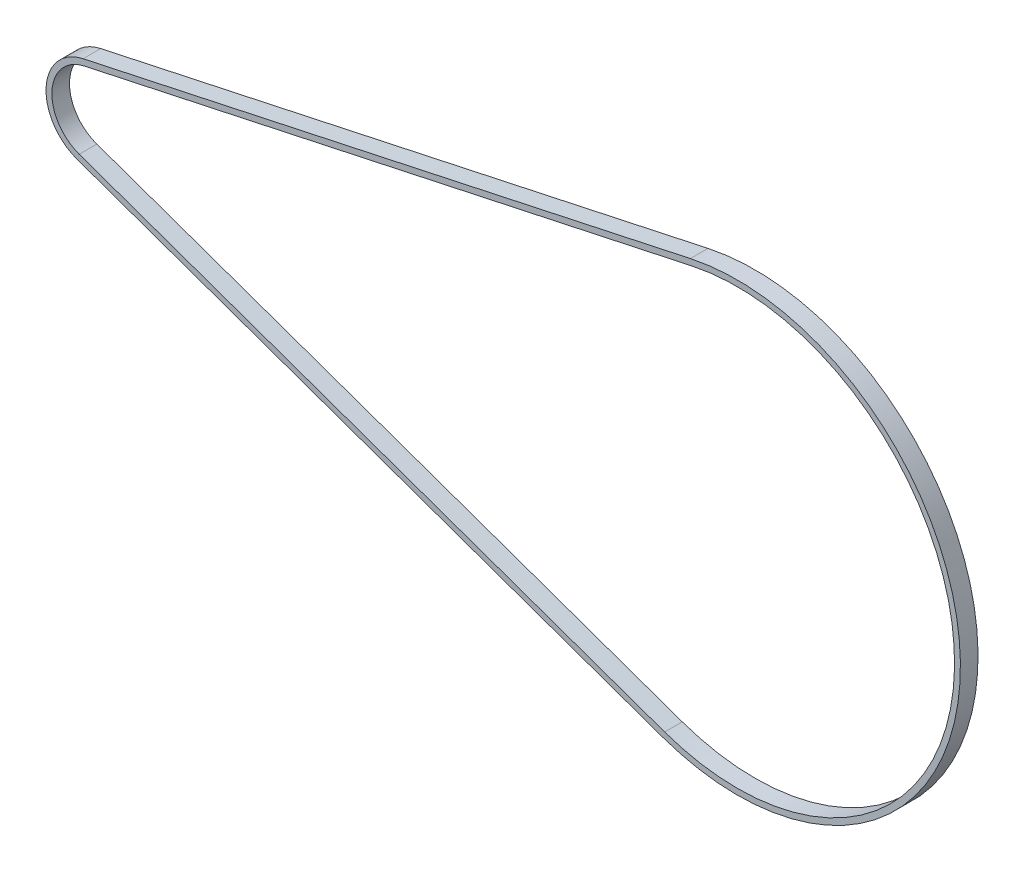
ISO-10303-21;
HEADER;
FILE_DESCRIPTION(('STEP AP214'),'2;1');
FILE_NAME('part.step','',(''),(''),'','','');
FILE_SCHEMA(('AUTOMOTIVE_DESIGN { 1 0 10303 214 1 1 1 1 }'));
ENDSEC;
DATA;
#1=APPLICATION_CONTEXT('core data for automotive mechanical design processes');
#2=APPLICATION_PROTOCOL_DEFINITION('international standard','automotive_design',2000,#1);
#3=PRODUCT_CONTEXT('',#1,'mechanical');
#4=PRODUCT('Part','Part','',(#3));
#5=PRODUCT_RELATED_PRODUCT_CATEGORY('part','',(#4));
#6=PRODUCT_DEFINITION_FORMATION('','',#4);
#7=PRODUCT_DEFINITION_CONTEXT('part definition',#1,'design');
#8=PRODUCT_DEFINITION('design','',#6,#7);
#9=PRODUCT_DEFINITION_SHAPE('','',#8);
#10=(LENGTH_UNIT() NAMED_UNIT(*) SI_UNIT(.MILLI.,.METRE.));
#11=(NAMED_UNIT(*) PLANE_ANGLE_UNIT() SI_UNIT($,.RADIAN.));
#12=(NAMED_UNIT(*) SI_UNIT($,.STERADIAN.) SOLID_ANGLE_UNIT());
#13=UNCERTAINTY_MEASURE_WITH_UNIT(LENGTH_MEASURE(1.E-05),#10,'distance_accuracy_value','');
#14=(GEOMETRIC_REPRESENTATION_CONTEXT(3) GLOBAL_UNCERTAINTY_ASSIGNED_CONTEXT((#13)) GLOBAL_UNIT_ASSIGNED_CONTEXT((#10,
#11,#12)) REPRESENTATION_CONTEXT('',''));
#15=CARTESIAN_POINT('',(0.,0.,0.));
#16=DIRECTION('',(0.,0.,1.));
#17=DIRECTION('',(1.,0.,0.));
#18=AXIS2_PLACEMENT_3D('',#15,#16,#17);
#19=CARTESIAN_POINT('',(0.,0.,3.81));
#20=DIRECTION('',(0.,0.,-1.));
#21=DIRECTION('',(-1.,0.,0.));
#22=AXIS2_PLACEMENT_3D('',#19,#20,#21);
#23=CYLINDRICAL_SURFACE('',#22,20.32);
#24=CARTESIAN_POINT('',(0.,0.,-3.81));
#25=DIRECTION('',(0.,0.,-1.));
#26=DIRECTION('',(-1.,0.,0.));
#27=AXIS2_PLACEMENT_3D('',#24,#25,#26);
#28=CIRCLE('',#27,20.32);
#29=CARTESIAN_POINT('',(-6.7917738220056,-19.1513500398985,-3.81));
#30=VERTEX_POINT('',#29);
#31=CARTESIAN_POINT('',(-4.27179083616771,19.8659055432173,-3.81));
#32=VERTEX_POINT('',#31);
#33=EDGE_CURVE('E157',#30,#32,#28,.T.);
#34=ORIENTED_EDGE('',*,*,#33,.F.);
#35=DIRECTION('',(0.,0.,-1.));
#36=VECTOR('',#35,1.);
#37=CARTESIAN_POINT('',(-6.7917738220056,-19.1513500398985,3.81));
#38=LINE('',#37,#36);
#39=CARTESIAN_POINT('',(-6.7917738220056,-19.1513500398985,3.81));
#40=VERTEX_POINT('',#39);
#41=EDGE_CURVE('E12',#40,#30,#38,.T.);
#42=ORIENTED_EDGE('',*,*,#41,.F.);
#43=CARTESIAN_POINT('',(0.,0.,3.81));
#44=DIRECTION('',(0.,0.,-1.));
#45=DIRECTION('',(-1.,0.,0.));
#46=AXIS2_PLACEMENT_3D('',#43,#44,#45);
#47=CIRCLE('',#46,20.32);
#48=CARTESIAN_POINT('',(-4.27179083616771,19.8659055432173,3.81));
#49=VERTEX_POINT('',#48);
#50=EDGE_CURVE('E161',#40,#49,#47,.T.);
#51=ORIENTED_EDGE('',*,*,#50,.T.);
#52=DIRECTION('',(0.,0.,-1.));
#53=VECTOR('',#52,1.);
#54=CARTESIAN_POINT('',(-4.27179083616771,19.8659055432173,3.81));
#55=LINE('',#54,#53);
#56=EDGE_CURVE('E62',#49,#32,#55,.T.);
#57=ORIENTED_EDGE('',*,*,#56,.T.);
#58=EDGE_LOOP('',(#34,#42,#51,#57));
#59=FACE_BOUND('',#58,.T.);
#60=ADVANCED_FACE('F59',(#59),#23,.T.);
#61=CARTESIAN_POINT('',(-6.79177382200558,-19.1513500398985,3.81));
#62=DIRECTION('',(-0.334240837697125,-0.942487698813902,0.));
#63=DIRECTION('',(0.942487698813902,-0.334240837697125,0.));
#64=AXIS2_PLACEMENT_3D('',#61,#62,#63);
#65=PLANE('',#64);
#66=DIRECTION('',(-0.942487698813902,0.334240837697125,0.));
#67=VECTOR('',#66,1.);
#68=CARTESIAN_POINT('',(-6.79177382200558,-19.1513500398985,-3.81));
#69=LINE('',#68,#67);
#70=CARTESIAN_POINT('',(246.48321338445,-108.971985362938,-3.81));
#71=VERTEX_POINT('',#70);
#72=EDGE_CURVE('E165',#71,#30,#69,.T.);
#73=ORIENTED_EDGE('',*,*,#72,.F.);
#74=DIRECTION('',(0.,0.,-1.));
#75=VECTOR('',#74,1.);
#76=CARTESIAN_POINT('',(246.48321338445,-108.971985362938,3.81));
#77=LINE('',#76,#75);
#78=CARTESIAN_POINT('',(246.48321338445,-108.971985362938,3.81));
#79=VERTEX_POINT('',#78);
#80=EDGE_CURVE('E67',#79,#71,#77,.T.);
#81=ORIENTED_EDGE('',*,*,#80,.F.);
#82=DIRECTION('',(-0.942487698813902,0.334240837697125,0.));
#83=VECTOR('',#82,1.);
#84=CARTESIAN_POINT('',(-6.79177382200558,-19.1513500398985,3.81));
#85=LINE('',#84,#83);
#86=EDGE_CURVE('E171',#79,#40,#85,.T.);
#87=ORIENTED_EDGE('',*,*,#86,.T.);
#88=ORIENTED_EDGE('',*,*,#41,.T.);
#89=EDGE_LOOP('',(#73,#81,#87,#88));
#90=FACE_BOUND('',#89,.T.);
#91=ADVANCED_FACE('F197',(#90),#65,.T.);
#92=CARTESIAN_POINT('',(278.744139038976,-18.0030726734202,3.81));
#93=DIRECTION('',(0.,0.,-1.));
#94=DIRECTION('',(-1.,0.,0.));
#95=AXIS2_PLACEMENT_3D('',#92,#93,#94);
#96=CYLINDRICAL_SURFACE('',#95,96.52);
#97=CARTESIAN_POINT('',(278.744139038976,-18.0030726734202,-3.81));
#98=DIRECTION('',(0.,0.,-1.));
#99=DIRECTION('',(-1.,0.,0.));
#100=AXIS2_PLACEMENT_3D('',#97,#98,#99);
#101=CIRCLE('',#100,96.52);
#102=CARTESIAN_POINT('',(258.45313256718,76.3599786568622,-3.81));
#103=VERTEX_POINT('',#102);
#104=EDGE_CURVE('E179',#103,#71,#101,.T.);
#105=ORIENTED_EDGE('',*,*,#104,.F.);
#106=DIRECTION('',(0.,0.,-1.));
#107=VECTOR('',#106,1.);
#108=CARTESIAN_POINT('',(258.45313256718,76.3599786568622,3.81));
#109=LINE('',#108,#107);
#110=CARTESIAN_POINT('',(258.45313256718,76.3599786568622,3.81));
#111=VERTEX_POINT('',#110);
#112=EDGE_CURVE('E184',#111,#103,#109,.T.);
#113=ORIENTED_EDGE('',*,*,#112,.F.);
#114=CARTESIAN_POINT('',(278.744139038976,-18.0030726734202,3.81));
#115=DIRECTION('',(0.,0.,-1.));
#116=DIRECTION('',(-1.,0.,0.));
#117=AXIS2_PLACEMENT_3D('',#114,#115,#116);
#118=CIRCLE('',#117,96.52);
#119=EDGE_CURVE('E168',#111,#79,#118,.T.);
#120=ORIENTED_EDGE('',*,*,#119,.T.);
#121=ORIENTED_EDGE('',*,*,#80,.T.);
#122=EDGE_LOOP('',(#105,#113,#120,#121));
#123=FACE_BOUND('',#122,.T.);
#124=ADVANCED_FACE('F201',(#123),#96,.T.);
#125=CARTESIAN_POINT('',(-4.27179083616771,19.8659055432173,3.81));
#126=DIRECTION('',(-0.210225926976758,0.977652831851247,0.));
#127=DIRECTION('',(-0.977652831851247,-0.210225926976758,0.));
#128=AXIS2_PLACEMENT_3D('',#125,#126,#127);
#129=PLANE('',#128);
#130=DIRECTION('',(0.977652831851247,0.210225926976758,0.));
#131=VECTOR('',#130,1.);
#132=CARTESIAN_POINT('',(-4.27179083616771,19.8659055432173,-3.81));
#133=LINE('',#132,#131);
#134=EDGE_CURVE('E176',#32,#103,#133,.T.);
#135=ORIENTED_EDGE('',*,*,#134,.F.);
#136=ORIENTED_EDGE('',*,*,#56,.F.);
#137=DIRECTION('',(0.977652831851247,0.210225926976758,0.));
#138=VECTOR('',#137,1.);
#139=CARTESIAN_POINT('',(-4.27179083616771,19.8659055432173,3.81));
#140=LINE('',#139,#138);
#141=EDGE_CURVE('E164',#49,#111,#140,.T.);
#142=ORIENTED_EDGE('',*,*,#141,.T.);
#143=ORIENTED_EDGE('',*,*,#112,.T.);
#144=EDGE_LOOP('',(#135,#136,#142,#143));
#145=FACE_BOUND('',#144,.T.);
#146=ADVANCED_FACE('F192',(#145),#129,.T.);
#147=CARTESIAN_POINT('',(0.,0.,3.81));
#148=DIRECTION('',(0.,0.,-1.));
#149=DIRECTION('',(-1.,0.,0.));
#150=AXIS2_PLACEMENT_3D('',#147,#148,#149);
#151=PLANE('',#150);
#152=DIRECTION('',(-0.942487698813902,0.334240837697125,0.));
#153=VECTOR('',#152,1.);
#154=CARTESIAN_POINT('',(247.3321851122,-106.578066607951,3.81));
#155=LINE('',#154,#153);
#156=CARTESIAN_POINT('',(247.3321851122,-106.578066607951,3.81));
#157=VERTEX_POINT('',#156);
#158=CARTESIAN_POINT('',(-5.94280209425489,-16.7574312849112,3.81));
#159=VERTEX_POINT('',#158);
#160=EDGE_CURVE('E132',#157,#159,#155,.T.);
#161=ORIENTED_EDGE('',*,*,#160,.T.);
#162=CARTESIAN_POINT('',(0.,0.,3.81));
#163=DIRECTION('',(0.,0.,-1.));
#164=DIRECTION('',(-1.,0.,0.));
#165=AXIS2_PLACEMENT_3D('',#162,#163,#164);
#166=CIRCLE('',#165,17.78);
#167=CARTESIAN_POINT('',(-3.73781698164675,17.3826673503152,3.81));
#168=VERTEX_POINT('',#167);
#169=EDGE_CURVE('E126',#159,#168,#166,.T.);
#170=ORIENTED_EDGE('',*,*,#169,.T.);
#171=DIRECTION('',(0.977652831851247,0.210225926976758,0.));
#172=VECTOR('',#171,1.);
#173=CARTESIAN_POINT('',(-3.73781698164675,17.3826673503152,3.81));
#174=LINE('',#173,#172);
#175=CARTESIAN_POINT('',(258.9871064217,73.87674046396,3.81));
#176=VERTEX_POINT('',#175);
#177=EDGE_CURVE('E135',#168,#176,#174,.T.);
#178=ORIENTED_EDGE('',*,*,#177,.T.);
#179=CARTESIAN_POINT('',(278.744139038976,-18.0030726734202,3.81));
#180=DIRECTION('',(0.,0.,-1.));
#181=DIRECTION('',(-1.,0.,0.));
#182=AXIS2_PLACEMENT_3D('',#179,#180,#181);
#183=CIRCLE('',#182,93.98);
#184=EDGE_CURVE('E75',#176,#157,#183,.T.);
#185=ORIENTED_EDGE('',*,*,#184,.T.);
#186=EDGE_LOOP('',(#161,#170,#178,#185));
#187=FACE_BOUND('',#186,.T.);
#188=ORIENTED_EDGE('',*,*,#50,.F.);
#189=ORIENTED_EDGE('',*,*,#86,.F.);
#190=ORIENTED_EDGE('',*,*,#119,.F.);
#191=ORIENTED_EDGE('',*,*,#141,.F.);
#192=EDGE_LOOP('',(#188,#189,#190,#191));
#193=FACE_BOUND('',#192,.T.);
#194=ADVANCED_FACE('F139',(#187,#193),#151,.F.);
#195=CARTESIAN_POINT('',(0.,0.,-3.81));
#196=DIRECTION('',(0.,0.,-1.));
#197=DIRECTION('',(-1.,0.,0.));
#198=AXIS2_PLACEMENT_3D('',#195,#196,#197);
#199=PLANE('',#198);
#200=CARTESIAN_POINT('',(0.,0.,-3.81));
#201=DIRECTION('',(0.,0.,-1.));
#202=DIRECTION('',(-1.,0.,0.));
#203=AXIS2_PLACEMENT_3D('',#200,#201,#202);
#204=CIRCLE('',#203,17.78);
#205=CARTESIAN_POINT('',(-5.94280209425489,-16.7574312849112,-3.81));
#206=VERTEX_POINT('',#205);
#207=CARTESIAN_POINT('',(-3.73781698164675,17.3826673503152,-3.81));
#208=VERTEX_POINT('',#207);
#209=EDGE_CURVE('E83',#206,#208,#204,.T.);
#210=ORIENTED_EDGE('',*,*,#209,.F.);
#211=DIRECTION('',(-0.942487698813902,0.334240837697125,0.));
#212=VECTOR('',#211,1.);
#213=CARTESIAN_POINT('',(247.3321851122,-106.578066607951,-3.81));
#214=LINE('',#213,#212);
#215=CARTESIAN_POINT('',(247.3321851122,-106.578066607951,-3.81));
#216=VERTEX_POINT('',#215);
#217=EDGE_CURVE('E142',#216,#206,#214,.T.);
#218=ORIENTED_EDGE('',*,*,#217,.F.);
#219=CARTESIAN_POINT('',(278.744139038976,-18.0030726734202,-3.81));
#220=DIRECTION('',(0.,0.,-1.));
#221=DIRECTION('',(-1.,0.,0.));
#222=AXIS2_PLACEMENT_3D('',#219,#220,#221);
#223=CIRCLE('',#222,93.98);
#224=CARTESIAN_POINT('',(258.9871064217,73.87674046396,-3.81));
#225=VERTEX_POINT('',#224);
#226=EDGE_CURVE('E145',#225,#216,#223,.T.);
#227=ORIENTED_EDGE('',*,*,#226,.F.);
#228=DIRECTION('',(0.977652831851247,0.210225926976758,0.));
#229=VECTOR('',#228,1.);
#230=CARTESIAN_POINT('',(-3.73781698164675,17.3826673503152,-3.81));
#231=LINE('',#230,#229);
#232=EDGE_CURVE('E151',#208,#225,#231,.T.);
#233=ORIENTED_EDGE('',*,*,#232,.F.);
#234=EDGE_LOOP('',(#210,#218,#227,#233));
#235=FACE_BOUND('',#234,.T.);
#236=ORIENTED_EDGE('',*,*,#33,.T.);
#237=ORIENTED_EDGE('',*,*,#134,.T.);
#238=ORIENTED_EDGE('',*,*,#104,.T.);
#239=ORIENTED_EDGE('',*,*,#72,.T.);
#240=EDGE_LOOP('',(#236,#237,#238,#239));
#241=FACE_BOUND('',#240,.T.);
#242=ADVANCED_FACE('F194',(#235,#241),#199,.T.);
#243=CARTESIAN_POINT('',(0.,0.,3.81));
#244=DIRECTION('',(0.,0.,-1.));
#245=DIRECTION('',(-1.,0.,0.));
#246=AXIS2_PLACEMENT_3D('',#243,#244,#245);
#247=CYLINDRICAL_SURFACE('',#246,17.78);
#248=ORIENTED_EDGE('',*,*,#209,.T.);
#249=DIRECTION('',(0.,0.,-1.));
#250=VECTOR('',#249,1.);
#251=CARTESIAN_POINT('',(-3.73781698164675,17.3826673503152,3.81));
#252=LINE('',#251,#250);
#253=EDGE_CURVE('E122',#168,#208,#252,.T.);
#254=ORIENTED_EDGE('',*,*,#253,.F.);
#255=ORIENTED_EDGE('',*,*,#169,.F.);
#256=DIRECTION('',(0.,0.,-1.));
#257=VECTOR('',#256,1.);
#258=CARTESIAN_POINT('',(-5.94280209425489,-16.7574312849112,3.81));
#259=LINE('',#258,#257);
#260=EDGE_CURVE('E155',#159,#206,#259,.T.);
#261=ORIENTED_EDGE('',*,*,#260,.T.);
#262=EDGE_LOOP('',(#248,#254,#255,#261));
#263=FACE_BOUND('',#262,.T.);
#264=ADVANCED_FACE('F124',(#263),#247,.F.);
#265=CARTESIAN_POINT('',(247.3321851122,-106.578066607951,3.81));
#266=DIRECTION('',(-0.334240837697125,-0.942487698813902,0.));
#267=DIRECTION('',(0.942487698813902,-0.334240837697125,0.));
#268=AXIS2_PLACEMENT_3D('',#265,#266,#267);
#269=PLANE('',#268);
#270=ORIENTED_EDGE('',*,*,#217,.T.);
#271=ORIENTED_EDGE('',*,*,#260,.F.);
#272=ORIENTED_EDGE('',*,*,#160,.F.);
#273=DIRECTION('',(0.,0.,-1.));
#274=VECTOR('',#273,1.);
#275=CARTESIAN_POINT('',(247.3321851122,-106.578066607951,3.81));
#276=LINE('',#275,#274);
#277=EDGE_CURVE('E158',#157,#216,#276,.T.);
#278=ORIENTED_EDGE('',*,*,#277,.T.);
#279=EDGE_LOOP('',(#270,#271,#272,#278));
#280=FACE_BOUND('',#279,.T.);
#281=ADVANCED_FACE('F252',(#280),#269,.F.);
#282=CARTESIAN_POINT('',(278.744139038976,-18.0030726734202,3.81));
#283=DIRECTION('',(0.,0.,-1.));
#284=DIRECTION('',(-1.,0.,0.));
#285=AXIS2_PLACEMENT_3D('',#282,#283,#284);
#286=CYLINDRICAL_SURFACE('',#285,93.98);
#287=ORIENTED_EDGE('',*,*,#226,.T.);
#288=ORIENTED_EDGE('',*,*,#277,.F.);
#289=ORIENTED_EDGE('',*,*,#184,.F.);
#290=DIRECTION('',(0.,0.,-1.));
#291=VECTOR('',#290,1.);
#292=CARTESIAN_POINT('',(258.9871064217,73.87674046396,3.81));
#293=LINE('',#292,#291);
#294=EDGE_CURVE('E131',#176,#225,#293,.T.);
#295=ORIENTED_EDGE('',*,*,#294,.T.);
#296=EDGE_LOOP('',(#287,#288,#289,#295));
#297=FACE_BOUND('',#296,.T.);
#298=ADVANCED_FACE('F261',(#297),#286,.F.);
#299=CARTESIAN_POINT('',(-3.73781698164675,17.3826673503152,3.81));
#300=DIRECTION('',(-0.210225926976758,0.977652831851247,0.));
#301=DIRECTION('',(-0.977652831851247,-0.210225926976758,0.));
#302=AXIS2_PLACEMENT_3D('',#299,#300,#301);
#303=PLANE('',#302);
#304=ORIENTED_EDGE('',*,*,#232,.T.);
#305=ORIENTED_EDGE('',*,*,#294,.F.);
#306=ORIENTED_EDGE('',*,*,#177,.F.);
#307=ORIENTED_EDGE('',*,*,#253,.T.);
#308=EDGE_LOOP('',(#304,#305,#306,#307));
#309=FACE_BOUND('',#308,.T.);
#310=ADVANCED_FACE('F136',(#309),#303,.F.);
#311=CLOSED_SHELL('',(#60,#91,#124,#146,#194,#242,#264,#281,#298,#310));
#312=MANIFOLD_SOLID_BREP('B2',#311);
#313=ADVANCED_BREP_SHAPE_REPRESENTATION('',(#18,#312),#14);
#314=SHAPE_DEFINITION_REPRESENTATION(#9,#313);
ENDSEC;
END-ISO-10303-21;
